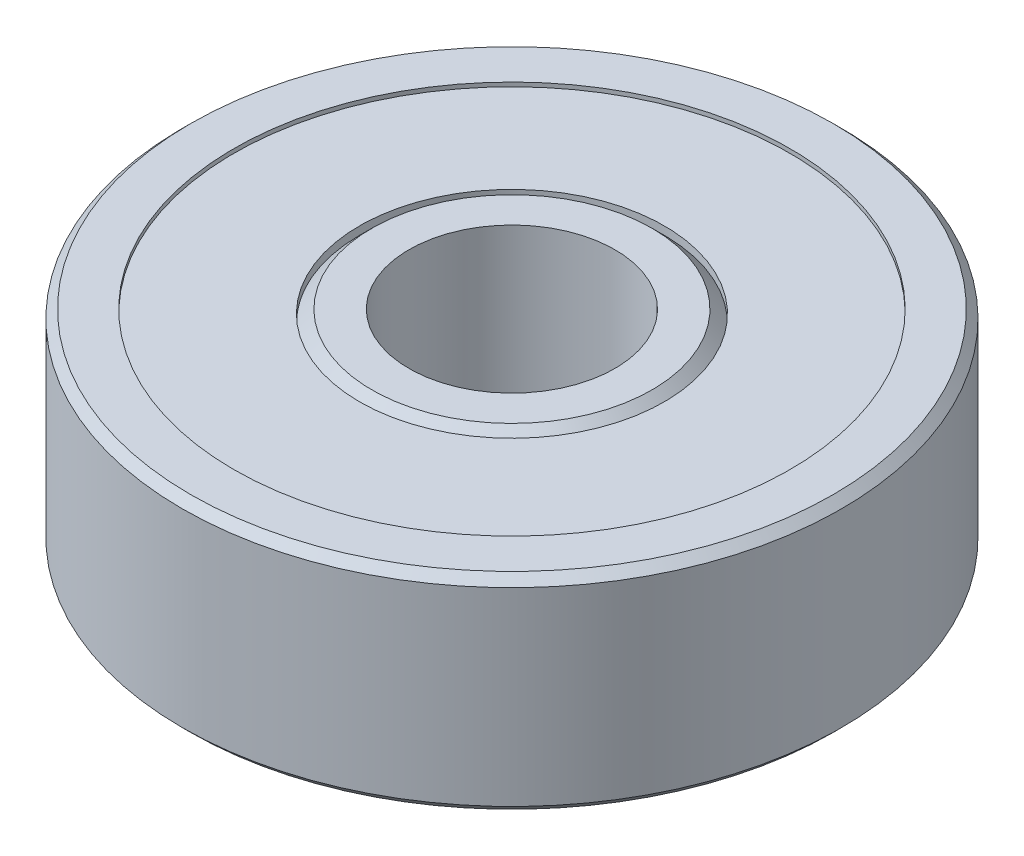
ISO-10303-21;
HEADER;
FILE_DESCRIPTION(('STEP AP214'),'2;1');
FILE_NAME('part.step','',(''),(''),'','','');
FILE_SCHEMA(('AUTOMOTIVE_DESIGN { 1 0 10303 214 1 1 1 1 }'));
ENDSEC;
DATA;
#1=APPLICATION_CONTEXT('core data for automotive mechanical design processes');
#2=APPLICATION_PROTOCOL_DEFINITION('international standard','automotive_design',2000,#1);
#3=PRODUCT_CONTEXT('',#1,'mechanical');
#4=PRODUCT('Part','Part','',(#3));
#5=PRODUCT_RELATED_PRODUCT_CATEGORY('part','',(#4));
#6=PRODUCT_DEFINITION_FORMATION('','',#4);
#7=PRODUCT_DEFINITION_CONTEXT('part definition',#1,'design');
#8=PRODUCT_DEFINITION('design','',#6,#7);
#9=PRODUCT_DEFINITION_SHAPE('','',#8);
#10=(LENGTH_UNIT() NAMED_UNIT(*) SI_UNIT(.MILLI.,.METRE.));
#11=(NAMED_UNIT(*) PLANE_ANGLE_UNIT() SI_UNIT($,.RADIAN.));
#12=(NAMED_UNIT(*) SI_UNIT($,.STERADIAN.) SOLID_ANGLE_UNIT());
#13=UNCERTAINTY_MEASURE_WITH_UNIT(LENGTH_MEASURE(1.E-05),#10,'distance_accuracy_value','');
#14=(GEOMETRIC_REPRESENTATION_CONTEXT(3) GLOBAL_UNCERTAINTY_ASSIGNED_CONTEXT((#13)) GLOBAL_UNIT_ASSIGNED_CONTEXT((#10,
#11,#12)) REPRESENTATION_CONTEXT('',''));
#15=CARTESIAN_POINT('',(0.,0.,0.));
#16=DIRECTION('',(0.,0.,1.));
#17=DIRECTION('',(1.,0.,0.));
#18=AXIS2_PLACEMENT_3D('',#15,#16,#17);
#19=CARTESIAN_POINT('',(0.,5.,0.));
#20=DIRECTION('',(0.,1.,0.));
#21=DIRECTION('',(-0.537879441840209,0.,0.843021770801719));
#22=AXIS2_PLACEMENT_3D('',#19,#20,#21);
#23=PLANE('',#22);
#24=CARTESIAN_POINT('',(0.,5.,0.));
#25=DIRECTION('',(0.,1.,0.));
#26=DIRECTION('',(-0.537879441840209,0.,0.843021770801719));
#27=AXIS2_PLACEMENT_3D('',#24,#25,#26);
#28=CIRCLE('',#27,3.4);
#29=CARTESIAN_POINT('',(-1.82879010225671,5.,2.86627402072584));
#30=VERTEX_POINT('',#29);
#31=EDGE_CURVE('P0_E10',#30,#30,#28,.T.);
#32=ORIENTED_EDGE('',*,*,#31,.T.);
#33=EDGE_LOOP('',(#32));
#34=FACE_BOUND('',#33,.T.);
#35=CARTESIAN_POINT('',(0.,5.,0.));
#36=DIRECTION('',(0.,1.,0.));
#37=DIRECTION('',(-0.537879441840209,0.,0.843021770801719));
#38=AXIS2_PLACEMENT_3D('',#35,#36,#37);
#39=CIRCLE('',#38,2.5);
#40=CARTESIAN_POINT('',(-1.34469860460052,5.,2.1075544270043));
#41=VERTEX_POINT('',#40);
#42=EDGE_CURVE('P0_E35',#41,#41,#39,.T.);
#43=ORIENTED_EDGE('',*,*,#42,.F.);
#44=EDGE_LOOP('',(#43));
#45=FACE_BOUND('',#44,.T.);
#46=ADVANCED_FACE('P0_F15',(#34,#45),#23,.T.);
#47=CARTESIAN_POINT('',(0.,0.,0.));
#48=DIRECTION('',(0.,1.,0.));
#49=DIRECTION('',(-0.537879441840209,0.,0.843021770801719));
#50=AXIS2_PLACEMENT_3D('',#47,#48,#49);
#51=PLANE('',#50);
#52=CARTESIAN_POINT('',(0.,0.,0.));
#53=DIRECTION('',(0.,1.,0.));
#54=DIRECTION('',(-0.537879441840209,0.,0.843021770801719));
#55=AXIS2_PLACEMENT_3D('',#52,#53,#54);
#56=CIRCLE('',#55,3.4);
#57=CARTESIAN_POINT('',(-1.82879010225671,0.,2.86627402072584));
#58=VERTEX_POINT('',#57);
#59=EDGE_CURVE('P0_E22',#58,#58,#56,.F.);
#60=ORIENTED_EDGE('',*,*,#59,.T.);
#61=EDGE_LOOP('',(#60));
#62=FACE_BOUND('',#61,.T.);
#63=CARTESIAN_POINT('',(0.,0.,0.));
#64=DIRECTION('',(0.,1.,0.));
#65=DIRECTION('',(-0.537879441840209,0.,0.843021770801719));
#66=AXIS2_PLACEMENT_3D('',#63,#64,#65);
#67=CIRCLE('',#66,2.5);
#68=CARTESIAN_POINT('',(-1.34469860460052,0.,2.1075544270043));
#69=VERTEX_POINT('',#68);
#70=EDGE_CURVE('P0_E36',#69,#69,#67,.T.);
#71=ORIENTED_EDGE('',*,*,#70,.T.);
#72=EDGE_LOOP('',(#71));
#73=FACE_BOUND('',#72,.T.);
#74=ADVANCED_FACE('P0_F46',(#62,#73),#51,.F.);
#75=CARTESIAN_POINT('',(0.,5.,0.));
#76=DIRECTION('',(0.,-1.,0.));
#77=DIRECTION('',(0.537879441840209,0.,-0.843021770801719));
#78=AXIS2_PLACEMENT_3D('',#75,#76,#77);
#79=CYLINDRICAL_SURFACE('',#78,3.7);
#80=CARTESIAN_POINT('',(0.,0.300000000000003,0.));
#81=DIRECTION('',(0.,1.,0.));
#82=DIRECTION('',(-0.537879441840209,0.,0.843021770801719));
#83=AXIS2_PLACEMENT_3D('',#80,#81,#82);
#84=CIRCLE('',#83,3.7);
#85=CARTESIAN_POINT('',(-1.99015393480877,0.300000000000003,3.11918055196636));
#86=VERTEX_POINT('',#85);
#87=EDGE_CURVE('P0_E26',#86,#86,#84,.T.);
#88=ORIENTED_EDGE('',*,*,#87,.T.);
#89=EDGE_LOOP('',(#88));
#90=FACE_BOUND('',#89,.T.);
#91=CARTESIAN_POINT('',(0.,4.7,0.));
#92=DIRECTION('',(0.,1.,0.));
#93=DIRECTION('',(-0.537879441840209,0.,0.843021770801719));
#94=AXIS2_PLACEMENT_3D('',#91,#92,#93);
#95=CIRCLE('',#94,3.7);
#96=CARTESIAN_POINT('',(-1.99015393480877,4.7,3.11918055196636));
#97=VERTEX_POINT('',#96);
#98=EDGE_CURVE('P0_E30',#97,#97,#95,.F.);
#99=ORIENTED_EDGE('',*,*,#98,.T.);
#100=EDGE_LOOP('',(#99));
#101=FACE_BOUND('',#100,.T.);
#102=ADVANCED_FACE('P0_F52',(#90,#101),#79,.T.);
#103=CARTESIAN_POINT('',(0.,5.,0.));
#104=DIRECTION('',(0.,-1.,0.));
#105=DIRECTION('',(0.537879441840209,0.,-0.843021770801719));
#106=AXIS2_PLACEMENT_3D('',#103,#104,#105);
#107=CYLINDRICAL_SURFACE('',#106,2.5);
#108=ORIENTED_EDGE('',*,*,#42,.T.);
#109=EDGE_LOOP('',(#108));
#110=FACE_BOUND('',#109,.T.);
#111=ORIENTED_EDGE('',*,*,#70,.F.);
#112=EDGE_LOOP('',(#111));
#113=FACE_BOUND('',#112,.T.);
#114=ADVANCED_FACE('P0_F42',(#110,#113),#107,.F.);
#115=CARTESIAN_POINT('',(0.,0.300000000000003,0.));
#116=DIRECTION('',(0.,1.,0.));
#117=DIRECTION('',(-0.537879441840209,0.,0.843021770801719));
#118=AXIS2_PLACEMENT_3D('',#115,#116,#117);
#119=CONICAL_SURFACE('',#118,3.7,0.785398163397451);
#120=ORIENTED_EDGE('',*,*,#59,.F.);
#121=EDGE_LOOP('',(#120));
#122=FACE_BOUND('',#121,.T.);
#123=ORIENTED_EDGE('',*,*,#87,.F.);
#124=EDGE_LOOP('',(#123));
#125=FACE_BOUND('',#124,.T.);
#126=ADVANCED_FACE('P0_F58',(#122,#125),#119,.T.);
#127=CARTESIAN_POINT('',(0.,5.,0.));
#128=DIRECTION('',(0.,-1.,0.));
#129=DIRECTION('',(0.537879441840209,0.,-0.843021770801719));
#130=AXIS2_PLACEMENT_3D('',#127,#128,#129);
#131=CONICAL_SURFACE('',#130,3.4,0.785398163397448);
#132=ORIENTED_EDGE('',*,*,#98,.F.);
#133=EDGE_LOOP('',(#132));
#134=FACE_BOUND('',#133,.T.);
#135=ORIENTED_EDGE('',*,*,#31,.F.);
#136=EDGE_LOOP('',(#135));
#137=FACE_BOUND('',#136,.T.);
#138=ADVANCED_FACE('P0_F17',(#134,#137),#131,.T.);
#139=CLOSED_SHELL('',(#46,#74,#102,#114,#126,#138));
#140=MANIFOLD_SOLID_BREP('P0_B1',#139);
#141=CARTESIAN_POINT('',(0.,5.,0.));
#142=DIRECTION('',(0.,1.,0.));
#143=DIRECTION('',(0.,0.,1.));
#144=AXIS2_PLACEMENT_3D('',#141,#142,#143);
#145=PLANE('',#144);
#146=CARTESIAN_POINT('',(0.,5.,0.));
#147=DIRECTION('',(0.,1.,0.));
#148=DIRECTION('',(0.,0.,1.));
#149=AXIS2_PLACEMENT_3D('',#146,#147,#148);
#150=CIRCLE('',#149,7.80000000000001);
#151=CARTESIAN_POINT('',(0.,5.,7.80000000000001));
#152=VERTEX_POINT('',#151);
#153=EDGE_CURVE('P1_E9',#152,#152,#150,.T.);
#154=ORIENTED_EDGE('',*,*,#153,.T.);
#155=EDGE_LOOP('',(#154));
#156=FACE_BOUND('',#155,.T.);
#157=CARTESIAN_POINT('',(0.,5.,0.));
#158=DIRECTION('',(0.,1.,0.));
#159=DIRECTION('',(0.,0.,1.));
#160=AXIS2_PLACEMENT_3D('',#157,#158,#159);
#161=CIRCLE('',#160,6.75);
#162=CARTESIAN_POINT('',(0.,5.,6.75));
#163=VERTEX_POINT('',#162);
#164=EDGE_CURVE('P1_E34',#163,#163,#161,.T.);
#165=ORIENTED_EDGE('',*,*,#164,.F.);
#166=EDGE_LOOP('',(#165));
#167=FACE_BOUND('',#166,.T.);
#168=ADVANCED_FACE('P1_F14',(#156,#167),#145,.T.);
#169=CARTESIAN_POINT('',(0.,0.,0.));
#170=DIRECTION('',(0.,1.,0.));
#171=DIRECTION('',(0.,0.,1.));
#172=AXIS2_PLACEMENT_3D('',#169,#170,#171);
#173=PLANE('',#172);
#174=CARTESIAN_POINT('',(0.,0.,0.));
#175=DIRECTION('',(0.,1.,0.));
#176=DIRECTION('',(0.,0.,1.));
#177=AXIS2_PLACEMENT_3D('',#174,#175,#176);
#178=CIRCLE('',#177,7.8);
#179=CARTESIAN_POINT('',(0.,0.,7.8));
#180=VERTEX_POINT('',#179);
#181=EDGE_CURVE('P1_E21',#180,#180,#178,.F.);
#182=ORIENTED_EDGE('',*,*,#181,.T.);
#183=EDGE_LOOP('',(#182));
#184=FACE_BOUND('',#183,.T.);
#185=CARTESIAN_POINT('',(0.,0.,0.));
#186=DIRECTION('',(0.,1.,0.));
#187=DIRECTION('',(0.,0.,1.));
#188=AXIS2_PLACEMENT_3D('',#185,#186,#187);
#189=CIRCLE('',#188,6.75);
#190=CARTESIAN_POINT('',(0.,0.,6.75));
#191=VERTEX_POINT('',#190);
#192=EDGE_CURVE('P1_E35',#191,#191,#189,.T.);
#193=ORIENTED_EDGE('',*,*,#192,.T.);
#194=EDGE_LOOP('',(#193));
#195=FACE_BOUND('',#194,.T.);
#196=ADVANCED_FACE('P1_F45',(#184,#195),#173,.F.);
#197=CARTESIAN_POINT('',(0.,5.,0.));
#198=DIRECTION('',(0.,-1.,0.));
#199=DIRECTION('',(0.,0.,-1.));
#200=AXIS2_PLACEMENT_3D('',#197,#198,#199);
#201=CYLINDRICAL_SURFACE('',#200,8.);
#202=CARTESIAN_POINT('',(0.,0.199999999999999,0.));
#203=DIRECTION('',(0.,1.,0.));
#204=DIRECTION('',(0.,0.,1.));
#205=AXIS2_PLACEMENT_3D('',#202,#203,#204);
#206=CIRCLE('',#205,8.);
#207=CARTESIAN_POINT('',(0.,0.199999999999999,8.));
#208=VERTEX_POINT('',#207);
#209=EDGE_CURVE('P1_E25',#208,#208,#206,.T.);
#210=ORIENTED_EDGE('',*,*,#209,.T.);
#211=EDGE_LOOP('',(#210));
#212=FACE_BOUND('',#211,.T.);
#213=CARTESIAN_POINT('',(0.,4.80000000000001,0.));
#214=DIRECTION('',(0.,1.,0.));
#215=DIRECTION('',(0.,0.,1.));
#216=AXIS2_PLACEMENT_3D('',#213,#214,#215);
#217=CIRCLE('',#216,8.);
#218=CARTESIAN_POINT('',(0.,4.80000000000001,8.));
#219=VERTEX_POINT('',#218);
#220=EDGE_CURVE('P1_E29',#219,#219,#217,.F.);
#221=ORIENTED_EDGE('',*,*,#220,.T.);
#222=EDGE_LOOP('',(#221));
#223=FACE_BOUND('',#222,.T.);
#224=ADVANCED_FACE('P1_F51',(#212,#223),#201,.T.);
#225=CARTESIAN_POINT('',(0.,5.,0.));
#226=DIRECTION('',(0.,-1.,0.));
#227=DIRECTION('',(0.,0.,-1.));
#228=AXIS2_PLACEMENT_3D('',#225,#226,#227);
#229=CYLINDRICAL_SURFACE('',#228,6.75);
#230=ORIENTED_EDGE('',*,*,#164,.T.);
#231=EDGE_LOOP('',(#230));
#232=FACE_BOUND('',#231,.T.);
#233=ORIENTED_EDGE('',*,*,#192,.F.);
#234=EDGE_LOOP('',(#233));
#235=FACE_BOUND('',#234,.T.);
#236=ADVANCED_FACE('P1_F41',(#232,#235),#229,.F.);
#237=CARTESIAN_POINT('',(0.,0.199999999999999,0.));
#238=DIRECTION('',(0.,1.,0.));
#239=DIRECTION('',(0.,0.,1.));
#240=AXIS2_PLACEMENT_3D('',#237,#238,#239);
#241=CONICAL_SURFACE('',#240,8.,0.785398163397444);
#242=ORIENTED_EDGE('',*,*,#181,.F.);
#243=EDGE_LOOP('',(#242));
#244=FACE_BOUND('',#243,.T.);
#245=ORIENTED_EDGE('',*,*,#209,.F.);
#246=EDGE_LOOP('',(#245));
#247=FACE_BOUND('',#246,.T.);
#248=ADVANCED_FACE('P1_F57',(#244,#247),#241,.T.);
#249=CARTESIAN_POINT('',(0.,5.,0.));
#250=DIRECTION('',(0.,-1.,0.));
#251=DIRECTION('',(0.,0.,-1.));
#252=AXIS2_PLACEMENT_3D('',#249,#250,#251);
#253=CONICAL_SURFACE('',#252,7.80000000000001,0.785398163397448);
#254=ORIENTED_EDGE('',*,*,#220,.F.);
#255=EDGE_LOOP('',(#254));
#256=FACE_BOUND('',#255,.T.);
#257=ORIENTED_EDGE('',*,*,#153,.F.);
#258=EDGE_LOOP('',(#257));
#259=FACE_BOUND('',#258,.T.);
#260=ADVANCED_FACE('P1_F16',(#256,#259),#253,.T.);
#261=CLOSED_SHELL('',(#168,#196,#224,#236,#248,#260));
#262=MANIFOLD_SOLID_BREP('P1_B1',#261);
#263=CARTESIAN_POINT('',(0.,4.9,0.));
#264=DIRECTION('',(0.,1.,0.));
#265=DIRECTION('',(0.,0.,1.));
#266=AXIS2_PLACEMENT_3D('',#263,#264,#265);
#267=PLANE('',#266);
#268=CARTESIAN_POINT('',(0.,4.9,0.));
#269=DIRECTION('',(0.,1.,0.));
#270=DIRECTION('',(0.,0.,1.));
#271=AXIS2_PLACEMENT_3D('',#268,#269,#270);
#272=CIRCLE('',#271,6.75);
#273=CARTESIAN_POINT('',(0.,4.9,6.75));
#274=VERTEX_POINT('',#273);
#275=EDGE_CURVE('P2_E10',#274,#274,#272,.T.);
#276=ORIENTED_EDGE('',*,*,#275,.T.);
#277=EDGE_LOOP('',(#276));
#278=FACE_BOUND('',#277,.T.);
#279=CARTESIAN_POINT('',(0.,4.9,0.));
#280=DIRECTION('',(0.,1.,0.));
#281=DIRECTION('',(0.,0.,1.));
#282=AXIS2_PLACEMENT_3D('',#279,#280,#281);
#283=CIRCLE('',#282,3.7);
#284=CARTESIAN_POINT('',(0.,4.9,3.7));
#285=VERTEX_POINT('',#284);
#286=EDGE_CURVE('P2_E26',#285,#285,#283,.T.);
#287=ORIENTED_EDGE('',*,*,#286,.F.);
#288=EDGE_LOOP('',(#287));
#289=FACE_BOUND('',#288,.T.);
#290=ADVANCED_FACE('P2_F15',(#278,#289),#267,.T.);
#291=CARTESIAN_POINT('',(0.,0.1,0.));
#292=DIRECTION('',(0.,1.,0.));
#293=DIRECTION('',(0.,0.,1.));
#294=AXIS2_PLACEMENT_3D('',#291,#292,#293);
#295=PLANE('',#294);
#296=CARTESIAN_POINT('',(0.,0.1,0.));
#297=DIRECTION('',(0.,1.,0.));
#298=DIRECTION('',(0.,0.,1.));
#299=AXIS2_PLACEMENT_3D('',#296,#297,#298);
#300=CIRCLE('',#299,6.75);
#301=CARTESIAN_POINT('',(0.,0.1,6.75));
#302=VERTEX_POINT('',#301);
#303=EDGE_CURVE('P2_E19',#302,#302,#300,.T.);
#304=ORIENTED_EDGE('',*,*,#303,.F.);
#305=EDGE_LOOP('',(#304));
#306=FACE_BOUND('',#305,.T.);
#307=CARTESIAN_POINT('',(0.,0.1,0.));
#308=DIRECTION('',(0.,1.,0.));
#309=DIRECTION('',(0.,0.,1.));
#310=AXIS2_PLACEMENT_3D('',#307,#308,#309);
#311=CIRCLE('',#310,3.7);
#312=CARTESIAN_POINT('',(0.,0.1,3.7));
#313=VERTEX_POINT('',#312);
#314=EDGE_CURVE('P2_E28',#313,#313,#311,.T.);
#315=ORIENTED_EDGE('',*,*,#314,.T.);
#316=EDGE_LOOP('',(#315));
#317=FACE_BOUND('',#316,.T.);
#318=ADVANCED_FACE('P2_F38',(#306,#317),#295,.F.);
#319=CARTESIAN_POINT('',(0.,4.9,0.));
#320=DIRECTION('',(0.,-1.,0.));
#321=DIRECTION('',(0.,0.,-1.));
#322=AXIS2_PLACEMENT_3D('',#319,#320,#321);
#323=CYLINDRICAL_SURFACE('',#322,6.75);
#324=ORIENTED_EDGE('',*,*,#275,.F.);
#325=EDGE_LOOP('',(#324));
#326=FACE_BOUND('',#325,.T.);
#327=ORIENTED_EDGE('',*,*,#303,.T.);
#328=EDGE_LOOP('',(#327));
#329=FACE_BOUND('',#328,.T.);
#330=ADVANCED_FACE('P2_F17',(#326,#329),#323,.T.);
#331=CARTESIAN_POINT('',(0.,4.9,0.));
#332=DIRECTION('',(0.,-1.,0.));
#333=DIRECTION('',(0.,0.,-1.));
#334=AXIS2_PLACEMENT_3D('',#331,#332,#333);
#335=CYLINDRICAL_SURFACE('',#334,3.7);
#336=ORIENTED_EDGE('',*,*,#286,.T.);
#337=EDGE_LOOP('',(#336));
#338=FACE_BOUND('',#337,.T.);
#339=ORIENTED_EDGE('',*,*,#314,.F.);
#340=EDGE_LOOP('',(#339));
#341=FACE_BOUND('',#340,.T.);
#342=ADVANCED_FACE('P2_F34',(#338,#341),#335,.F.);
#343=CLOSED_SHELL('',(#290,#318,#330,#342));
#344=MANIFOLD_SOLID_BREP('P2_B1',#343);
#345=ADVANCED_BREP_SHAPE_REPRESENTATION('',(#18,#140,#262,#344),#14);
#346=SHAPE_DEFINITION_REPRESENTATION(#9,#345);
ENDSEC;
END-ISO-10303-21;
